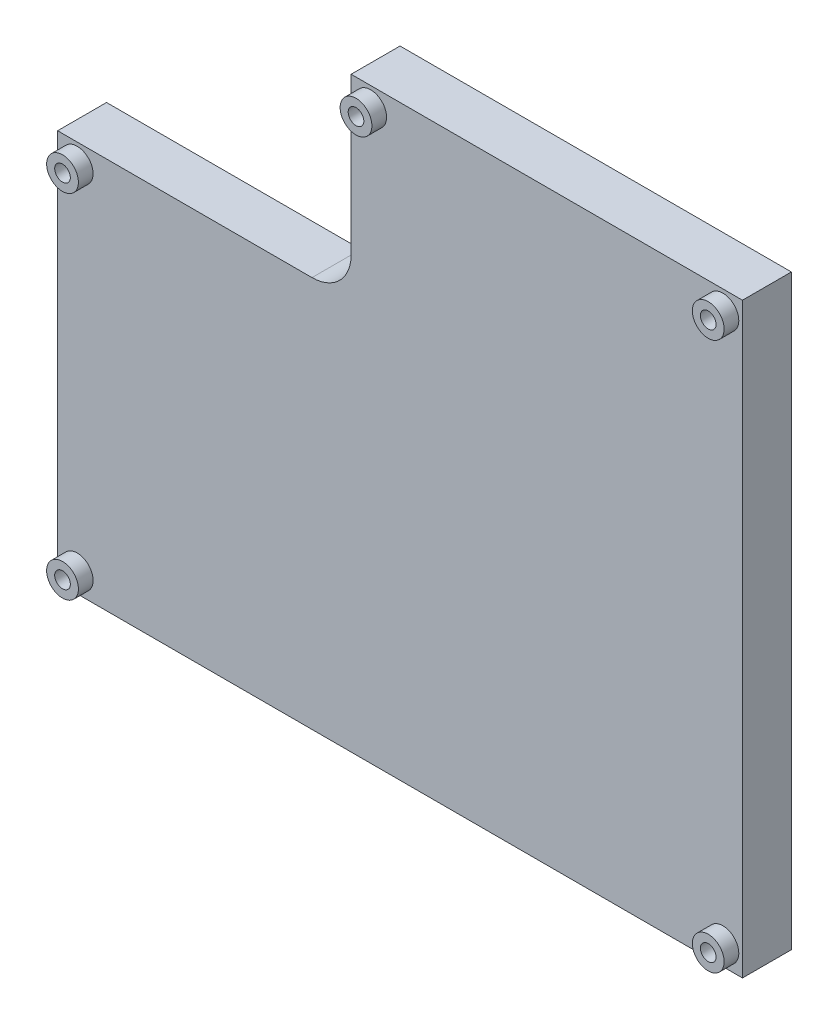
ISO-10303-21;
HEADER;
FILE_DESCRIPTION(('STEP AP214'),'2;1');
FILE_NAME('part.step','',(''),(''),'','','');
FILE_SCHEMA(('AUTOMOTIVE_DESIGN { 1 0 10303 214 1 1 1 1 }'));
ENDSEC;
DATA;
#1=APPLICATION_CONTEXT('core data for automotive mechanical design processes');
#2=APPLICATION_PROTOCOL_DEFINITION('international standard','automotive_design',2000,#1);
#3=PRODUCT_CONTEXT('',#1,'mechanical');
#4=PRODUCT('Part','Part','',(#3));
#5=PRODUCT_RELATED_PRODUCT_CATEGORY('part','',(#4));
#6=PRODUCT_DEFINITION_FORMATION('','',#4);
#7=PRODUCT_DEFINITION_CONTEXT('part definition',#1,'design');
#8=PRODUCT_DEFINITION('design','',#6,#7);
#9=PRODUCT_DEFINITION_SHAPE('','',#8);
#10=(LENGTH_UNIT() NAMED_UNIT(*) SI_UNIT(.MILLI.,.METRE.));
#11=(NAMED_UNIT(*) PLANE_ANGLE_UNIT() SI_UNIT($,.RADIAN.));
#12=(NAMED_UNIT(*) SI_UNIT($,.STERADIAN.) SOLID_ANGLE_UNIT());
#13=UNCERTAINTY_MEASURE_WITH_UNIT(LENGTH_MEASURE(1.E-05),#10,'distance_accuracy_value','');
#14=(GEOMETRIC_REPRESENTATION_CONTEXT(3) GLOBAL_UNCERTAINTY_ASSIGNED_CONTEXT((#13)) GLOBAL_UNIT_ASSIGNED_CONTEXT((#10,
#11,#12)) REPRESENTATION_CONTEXT('',''));
#15=CARTESIAN_POINT('',(0.,0.,0.));
#16=DIRECTION('',(0.,0.,1.));
#17=DIRECTION('',(1.,0.,0.));
#18=AXIS2_PLACEMENT_3D('',#15,#16,#17);
#19=CARTESIAN_POINT('',(-38.,-33.,6.5));
#20=DIRECTION('',(0.,0.,-1.));
#21=DIRECTION('',(0.,1.,0.));
#22=AXIS2_PLACEMENT_3D('',#19,#20,#21);
#23=CYLINDRICAL_SURFACE('',#22,1.62500000000001);
#24=CARTESIAN_POINT('',(-38.,-33.,5.));
#25=DIRECTION('',(0.,0.,-1.));
#26=DIRECTION('',(0.,1.,0.));
#27=AXIS2_PLACEMENT_3D('',#24,#25,#26);
#28=CIRCLE('',#27,1.62500000000001);
#29=CARTESIAN_POINT('',(-38.,-31.375,5.));
#30=VERTEX_POINT('',#29);
#31=EDGE_CURVE('E20',#30,#30,#28,.F.);
#32=ORIENTED_EDGE('',*,*,#31,.T.);
#33=EDGE_LOOP('',(#32));
#34=FACE_BOUND('',#33,.T.);
#35=CARTESIAN_POINT('',(-38.,-33.,6.5));
#36=DIRECTION('',(0.,0.,-1.));
#37=DIRECTION('',(0.,1.,0.));
#38=AXIS2_PLACEMENT_3D('',#35,#36,#37);
#39=CIRCLE('',#38,1.62500000000001);
#40=CARTESIAN_POINT('',(-38.,-31.375,6.5));
#41=VERTEX_POINT('',#40);
#42=EDGE_CURVE('E208',#41,#41,#39,.F.);
#43=ORIENTED_EDGE('',*,*,#42,.F.);
#44=EDGE_LOOP('',(#43));
#45=FACE_BOUND('',#44,.T.);
#46=ADVANCED_FACE('F16',(#34,#45),#23,.T.);
#47=CARTESIAN_POINT('',(28.,23.,6.5));
#48=DIRECTION('',(0.,0.,-1.));
#49=DIRECTION('',(0.,1.,0.));
#50=AXIS2_PLACEMENT_3D('',#47,#48,#49);
#51=CYLINDRICAL_SURFACE('',#50,1.625);
#52=CARTESIAN_POINT('',(28.,23.,5.));
#53=DIRECTION('',(0.,0.,-1.));
#54=DIRECTION('',(0.,1.,0.));
#55=AXIS2_PLACEMENT_3D('',#52,#53,#54);
#56=CIRCLE('',#55,1.625);
#57=CARTESIAN_POINT('',(28.,24.625,5.));
#58=VERTEX_POINT('',#57);
#59=EDGE_CURVE('E216',#58,#58,#56,.F.);
#60=ORIENTED_EDGE('',*,*,#59,.T.);
#61=EDGE_LOOP('',(#60));
#62=FACE_BOUND('',#61,.T.);
#63=CARTESIAN_POINT('',(28.,23.,6.5));
#64=DIRECTION('',(0.,0.,-1.));
#65=DIRECTION('',(0.,1.,0.));
#66=AXIS2_PLACEMENT_3D('',#63,#64,#65);
#67=CIRCLE('',#66,1.625);
#68=CARTESIAN_POINT('',(28.,24.625,6.5));
#69=VERTEX_POINT('',#68);
#70=EDGE_CURVE('E205',#69,#69,#67,.F.);
#71=ORIENTED_EDGE('',*,*,#70,.F.);
#72=EDGE_LOOP('',(#71));
#73=FACE_BOUND('',#72,.T.);
#74=ADVANCED_FACE('F280',(#62,#73),#51,.T.);
#75=CARTESIAN_POINT('',(-8.,23.,6.5));
#76=DIRECTION('',(0.,0.,-1.));
#77=DIRECTION('',(0.,1.,0.));
#78=AXIS2_PLACEMENT_3D('',#75,#76,#77);
#79=CYLINDRICAL_SURFACE('',#78,1.625);
#80=CARTESIAN_POINT('',(-8.,23.,5.));
#81=DIRECTION('',(0.,0.,-1.));
#82=DIRECTION('',(0.,1.,0.));
#83=AXIS2_PLACEMENT_3D('',#80,#81,#82);
#84=CIRCLE('',#83,1.625);
#85=CARTESIAN_POINT('',(-8.,24.625,5.));
#86=VERTEX_POINT('',#85);
#87=EDGE_CURVE('E214',#86,#86,#84,.F.);
#88=ORIENTED_EDGE('',*,*,#87,.T.);
#89=EDGE_LOOP('',(#88));
#90=FACE_BOUND('',#89,.T.);
#91=CARTESIAN_POINT('',(-8.,23.,6.5));
#92=DIRECTION('',(0.,0.,-1.));
#93=DIRECTION('',(0.,1.,0.));
#94=AXIS2_PLACEMENT_3D('',#91,#92,#93);
#95=CIRCLE('',#94,1.625);
#96=CARTESIAN_POINT('',(-8.,24.625,6.5));
#97=VERTEX_POINT('',#96);
#98=EDGE_CURVE('E202',#97,#97,#95,.F.);
#99=ORIENTED_EDGE('',*,*,#98,.F.);
#100=EDGE_LOOP('',(#99));
#101=FACE_BOUND('',#100,.T.);
#102=ADVANCED_FACE('F238',(#90,#101),#79,.T.);
#103=CARTESIAN_POINT('',(28.,-33.,6.5));
#104=DIRECTION('',(0.,0.,-1.));
#105=DIRECTION('',(0.,1.,0.));
#106=AXIS2_PLACEMENT_3D('',#103,#104,#105);
#107=CYLINDRICAL_SURFACE('',#106,1.625);
#108=CARTESIAN_POINT('',(28.,-33.,5.));
#109=DIRECTION('',(0.,0.,-1.));
#110=DIRECTION('',(0.,1.,0.));
#111=AXIS2_PLACEMENT_3D('',#108,#109,#110);
#112=CIRCLE('',#111,1.625);
#113=CARTESIAN_POINT('',(28.,-31.375,5.));
#114=VERTEX_POINT('',#113);
#115=EDGE_CURVE('E211',#114,#114,#112,.F.);
#116=ORIENTED_EDGE('',*,*,#115,.T.);
#117=EDGE_LOOP('',(#116));
#118=FACE_BOUND('',#117,.T.);
#119=CARTESIAN_POINT('',(28.,-33.,6.5));
#120=DIRECTION('',(0.,0.,-1.));
#121=DIRECTION('',(0.,1.,0.));
#122=AXIS2_PLACEMENT_3D('',#119,#120,#121);
#123=CIRCLE('',#122,1.625);
#124=CARTESIAN_POINT('',(28.,-31.375,6.5));
#125=VERTEX_POINT('',#124);
#126=EDGE_CURVE('E199',#125,#125,#123,.F.);
#127=ORIENTED_EDGE('',*,*,#126,.F.);
#128=EDGE_LOOP('',(#127));
#129=FACE_BOUND('',#128,.T.);
#130=ADVANCED_FACE('F227',(#118,#129),#107,.T.);
#131=CARTESIAN_POINT('',(30.,-35.,5.));
#132=DIRECTION('',(0.,0.,-1.));
#133=DIRECTION('',(-1.,0.,0.));
#134=AXIS2_PLACEMENT_3D('',#131,#132,#133);
#135=PLANE('',#134);
#136=CARTESIAN_POINT('',(-38.,3.,5.));
#137=DIRECTION('',(0.,0.,-1.));
#138=DIRECTION('',(0.,1.,0.));
#139=AXIS2_PLACEMENT_3D('',#136,#137,#138);
#140=CIRCLE('',#139,1.62500000000001);
#141=CARTESIAN_POINT('',(-38.,4.62500000000001,5.));
#142=VERTEX_POINT('',#141);
#143=EDGE_CURVE('E85',#142,#142,#140,.T.);
#144=ORIENTED_EDGE('',*,*,#143,.T.);
#145=EDGE_LOOP('',(#144));
#146=FACE_BOUND('',#145,.T.);
#147=ORIENTED_EDGE('',*,*,#115,.F.);
#148=EDGE_LOOP('',(#147));
#149=FACE_BOUND('',#148,.T.);
#150=ORIENTED_EDGE('',*,*,#87,.F.);
#151=EDGE_LOOP('',(#150));
#152=FACE_BOUND('',#151,.T.);
#153=ORIENTED_EDGE('',*,*,#59,.F.);
#154=EDGE_LOOP('',(#153));
#155=FACE_BOUND('',#154,.T.);
#156=ORIENTED_EDGE('',*,*,#31,.F.);
#157=EDGE_LOOP('',(#156));
#158=FACE_BOUND('',#157,.T.);
#159=DIRECTION('',(-1.,0.,0.));
#160=VECTOR('',#159,1.);
#161=CARTESIAN_POINT('',(-27.,5.,5.));
#162=LINE('',#161,#160);
#163=CARTESIAN_POINT('',(-14.,5.,5.));
#164=VERTEX_POINT('',#163);
#165=CARTESIAN_POINT('',(-40.,5.,5.));
#166=VERTEX_POINT('',#165);
#167=EDGE_CURVE('E78',#164,#166,#162,.T.);
#168=ORIENTED_EDGE('',*,*,#167,.T.);
#169=DIRECTION('',(0.,-1.,0.));
#170=VECTOR('',#169,1.);
#171=CARTESIAN_POINT('',(-40.,-15.,5.));
#172=LINE('',#171,#170);
#173=CARTESIAN_POINT('',(-40.,-35.,5.));
#174=VERTEX_POINT('',#173);
#175=EDGE_CURVE('E100',#166,#174,#172,.T.);
#176=ORIENTED_EDGE('',*,*,#175,.T.);
#177=DIRECTION('',(1.,0.,0.));
#178=VECTOR('',#177,1.);
#179=CARTESIAN_POINT('',(-5.,-35.,5.));
#180=LINE('',#179,#178);
#181=CARTESIAN_POINT('',(30.,-35.,5.));
#182=VERTEX_POINT('',#181);
#183=EDGE_CURVE('E124',#174,#182,#180,.T.);
#184=ORIENTED_EDGE('',*,*,#183,.T.);
#185=DIRECTION('',(0.,1.,0.));
#186=VECTOR('',#185,1.);
#187=CARTESIAN_POINT('',(30.,-5.,5.));
#188=LINE('',#187,#186);
#189=CARTESIAN_POINT('',(30.,25.,5.));
#190=VERTEX_POINT('',#189);
#191=EDGE_CURVE('E134',#182,#190,#188,.T.);
#192=ORIENTED_EDGE('',*,*,#191,.T.);
#193=DIRECTION('',(-1.,0.,0.));
#194=VECTOR('',#193,1.);
#195=CARTESIAN_POINT('',(10.,25.,5.));
#196=LINE('',#195,#194);
#197=CARTESIAN_POINT('',(-10.,25.,5.));
#198=VERTEX_POINT('',#197);
#199=EDGE_CURVE('E144',#190,#198,#196,.T.);
#200=ORIENTED_EDGE('',*,*,#199,.T.);
#201=DIRECTION('',(0.,-1.,0.));
#202=VECTOR('',#201,1.);
#203=CARTESIAN_POINT('',(-10.,17.,5.));
#204=LINE('',#203,#202);
#205=CARTESIAN_POINT('',(-10.,9.,5.));
#206=VERTEX_POINT('',#205);
#207=EDGE_CURVE('E80',#198,#206,#204,.T.);
#208=ORIENTED_EDGE('',*,*,#207,.T.);
#209=CARTESIAN_POINT('',(-14.,9.,5.));
#210=DIRECTION('',(0.,0.,-1.));
#211=DIRECTION('',(0.,1.,0.));
#212=AXIS2_PLACEMENT_3D('',#209,#210,#211);
#213=CIRCLE('',#212,4.);
#214=EDGE_CURVE('E74',#164,#206,#213,.F.);
#215=ORIENTED_EDGE('',*,*,#214,.F.);
#216=EDGE_LOOP('',(#168,#176,#184,#192,#200,#208,#215));
#217=FACE_BOUND('',#216,.T.);
#218=ADVANCED_FACE('F76',(#146,#149,#152,#155,#158,#217),#135,.F.);
#219=CARTESIAN_POINT('',(-39.6445,-34.6445,6.5));
#220=DIRECTION('',(0.,0.,1.));
#221=DIRECTION('',(1.,0.,0.));
#222=AXIS2_PLACEMENT_3D('',#219,#220,#221);
#223=PLANE('',#222);
#224=CARTESIAN_POINT('',(-38.,-33.,6.5));
#225=DIRECTION('',(0.,0.,-1.));
#226=DIRECTION('',(0.,1.,0.));
#227=AXIS2_PLACEMENT_3D('',#224,#225,#226);
#228=CIRCLE('',#227,0.800000000000002);
#229=CARTESIAN_POINT('',(-38.,-32.2,6.5));
#230=VERTEX_POINT('',#229);
#231=EDGE_CURVE('E107',#230,#230,#228,.F.);
#232=ORIENTED_EDGE('',*,*,#231,.F.);
#233=EDGE_LOOP('',(#232));
#234=FACE_BOUND('',#233,.T.);
#235=ORIENTED_EDGE('',*,*,#42,.T.);
#236=EDGE_LOOP('',(#235));
#237=FACE_BOUND('',#236,.T.);
#238=ADVANCED_FACE('F226',(#234,#237),#223,.T.);
#239=CARTESIAN_POINT('',(26.3555,21.3555,6.5));
#240=DIRECTION('',(0.,0.,1.));
#241=DIRECTION('',(1.,0.,0.));
#242=AXIS2_PLACEMENT_3D('',#239,#240,#241);
#243=PLANE('',#242);
#244=CARTESIAN_POINT('',(28.,23.,6.5));
#245=DIRECTION('',(0.,0.,-1.));
#246=DIRECTION('',(0.,1.,0.));
#247=AXIS2_PLACEMENT_3D('',#244,#245,#246);
#248=CIRCLE('',#247,0.800000000000002);
#249=CARTESIAN_POINT('',(28.,23.8,6.5));
#250=VERTEX_POINT('',#249);
#251=EDGE_CURVE('E192',#250,#250,#248,.F.);
#252=ORIENTED_EDGE('',*,*,#251,.F.);
#253=EDGE_LOOP('',(#252));
#254=FACE_BOUND('',#253,.T.);
#255=ORIENTED_EDGE('',*,*,#70,.T.);
#256=EDGE_LOOP('',(#255));
#257=FACE_BOUND('',#256,.T.);
#258=ADVANCED_FACE('F235',(#254,#257),#243,.T.);
#259=CARTESIAN_POINT('',(-9.6445,21.3555,6.5));
#260=DIRECTION('',(0.,0.,1.));
#261=DIRECTION('',(1.,0.,0.));
#262=AXIS2_PLACEMENT_3D('',#259,#260,#261);
#263=PLANE('',#262);
#264=CARTESIAN_POINT('',(-8.,23.,6.5));
#265=DIRECTION('',(0.,0.,-1.));
#266=DIRECTION('',(0.,1.,0.));
#267=AXIS2_PLACEMENT_3D('',#264,#265,#266);
#268=CIRCLE('',#267,0.8);
#269=CARTESIAN_POINT('',(-8.,23.8,6.5));
#270=VERTEX_POINT('',#269);
#271=EDGE_CURVE('E189',#270,#270,#268,.F.);
#272=ORIENTED_EDGE('',*,*,#271,.F.);
#273=EDGE_LOOP('',(#272));
#274=FACE_BOUND('',#273,.T.);
#275=ORIENTED_EDGE('',*,*,#98,.T.);
#276=EDGE_LOOP('',(#275));
#277=FACE_BOUND('',#276,.T.);
#278=ADVANCED_FACE('F322',(#274,#277),#263,.T.);
#279=CARTESIAN_POINT('',(26.3555,-34.6445,6.5));
#280=DIRECTION('',(0.,0.,1.));
#281=DIRECTION('',(1.,0.,0.));
#282=AXIS2_PLACEMENT_3D('',#279,#280,#281);
#283=PLANE('',#282);
#284=CARTESIAN_POINT('',(28.,-33.,6.5));
#285=DIRECTION('',(0.,0.,-1.));
#286=DIRECTION('',(0.,1.,0.));
#287=AXIS2_PLACEMENT_3D('',#284,#285,#286);
#288=CIRCLE('',#287,0.800000000000002);
#289=CARTESIAN_POINT('',(28.,-32.2,6.5));
#290=VERTEX_POINT('',#289);
#291=EDGE_CURVE('E186',#290,#290,#288,.F.);
#292=ORIENTED_EDGE('',*,*,#291,.F.);
#293=EDGE_LOOP('',(#292));
#294=FACE_BOUND('',#293,.T.);
#295=ORIENTED_EDGE('',*,*,#126,.T.);
#296=EDGE_LOOP('',(#295));
#297=FACE_BOUND('',#296,.T.);
#298=ADVANCED_FACE('F275',(#294,#297),#283,.T.);
#299=CARTESIAN_POINT('',(-38.,3.,6.5));
#300=DIRECTION('',(0.,0.,-1.));
#301=DIRECTION('',(0.,1.,0.));
#302=AXIS2_PLACEMENT_3D('',#299,#300,#301);
#303=CYLINDRICAL_SURFACE('',#302,1.62500000000001);
#304=ORIENTED_EDGE('',*,*,#143,.F.);
#305=EDGE_LOOP('',(#304));
#306=FACE_BOUND('',#305,.T.);
#307=CARTESIAN_POINT('',(-38.,3.,6.5));
#308=DIRECTION('',(0.,0.,-1.));
#309=DIRECTION('',(0.,1.,0.));
#310=AXIS2_PLACEMENT_3D('',#307,#308,#309);
#311=CIRCLE('',#310,1.62500000000001);
#312=CARTESIAN_POINT('',(-38.,4.62500000000001,6.5));
#313=VERTEX_POINT('',#312);
#314=EDGE_CURVE('E183',#313,#313,#311,.F.);
#315=ORIENTED_EDGE('',*,*,#314,.F.);
#316=EDGE_LOOP('',(#315));
#317=FACE_BOUND('',#316,.T.);
#318=ADVANCED_FACE('F273',(#306,#317),#303,.T.);
#319=CARTESIAN_POINT('',(-14.,9.,5.));
#320=DIRECTION('',(0.,0.,-1.));
#321=DIRECTION('',(0.,1.,0.));
#322=AXIS2_PLACEMENT_3D('',#319,#320,#321);
#323=CYLINDRICAL_SURFACE('',#322,4.);
#324=ORIENTED_EDGE('',*,*,#214,.T.);
#325=DIRECTION('',(0.,0.,-1.));
#326=VECTOR('',#325,1.);
#327=CARTESIAN_POINT('',(-10.,9.,2.5));
#328=LINE('',#327,#326);
#329=CARTESIAN_POINT('',(-9.999999985,9.,0.));
#330=VERTEX_POINT('',#329);
#331=EDGE_CURVE('E147',#206,#330,#328,.T.);
#332=ORIENTED_EDGE('',*,*,#331,.T.);
#333=CARTESIAN_POINT('',(-14.,9.,0.));
#334=DIRECTION('',(0.,0.,-1.));
#335=DIRECTION('',(0.,1.,0.));
#336=AXIS2_PLACEMENT_3D('',#333,#334,#335);
#337=CIRCLE('',#336,4.);
#338=CARTESIAN_POINT('',(-14.,5.00000001,0.));
#339=VERTEX_POINT('',#338);
#340=EDGE_CURVE('E96',#339,#330,#337,.F.);
#341=ORIENTED_EDGE('',*,*,#340,.F.);
#342=DIRECTION('',(0.,0.,1.));
#343=VECTOR('',#342,1.);
#344=CARTESIAN_POINT('',(-14.,5.,2.5));
#345=LINE('',#344,#343);
#346=EDGE_CURVE('E91',#339,#164,#345,.T.);
#347=ORIENTED_EDGE('',*,*,#346,.T.);
#348=EDGE_LOOP('',(#324,#332,#341,#347));
#349=FACE_BOUND('',#348,.T.);
#350=ADVANCED_FACE('F95',(#349),#323,.F.);
#351=CARTESIAN_POINT('',(-10.,9.,0.));
#352=DIRECTION('',(1.,0.,0.));
#353=DIRECTION('',(0.,1.,0.));
#354=AXIS2_PLACEMENT_3D('',#351,#352,#353);
#355=PLANE('',#354);
#356=ORIENTED_EDGE('',*,*,#331,.F.);
#357=ORIENTED_EDGE('',*,*,#207,.F.);
#358=DIRECTION('',(0.,0.,-1.));
#359=VECTOR('',#358,1.);
#360=CARTESIAN_POINT('',(-10.,25.,2.5));
#361=LINE('',#360,#359);
#362=CARTESIAN_POINT('',(-9.99999998,25.,0.));
#363=VERTEX_POINT('',#362);
#364=EDGE_CURVE('E141',#198,#363,#361,.T.);
#365=ORIENTED_EDGE('',*,*,#364,.T.);
#366=DIRECTION('',(0.,1.,0.));
#367=VECTOR('',#366,1.);
#368=CARTESIAN_POINT('',(-9.99999997,-5.,0.));
#369=LINE('',#368,#367);
#370=EDGE_CURVE('E138',#330,#363,#369,.T.);
#371=ORIENTED_EDGE('',*,*,#370,.F.);
#372=EDGE_LOOP('',(#356,#357,#365,#371));
#373=FACE_BOUND('',#372,.T.);
#374=ADVANCED_FACE('F272',(#373),#355,.F.);
#375=CARTESIAN_POINT('',(-10.,25.,5.));
#376=DIRECTION('',(0.,-1.,0.));
#377=DIRECTION('',(0.,0.,-1.));
#378=AXIS2_PLACEMENT_3D('',#375,#376,#377);
#379=PLANE('',#378);
#380=ORIENTED_EDGE('',*,*,#364,.F.);
#381=ORIENTED_EDGE('',*,*,#199,.F.);
#382=DIRECTION('',(0.,0.,-1.));
#383=VECTOR('',#382,1.);
#384=CARTESIAN_POINT('',(30.,25.,2.5));
#385=LINE('',#384,#383);
#386=CARTESIAN_POINT('',(30.,25.,0.));
#387=VERTEX_POINT('',#386);
#388=EDGE_CURVE('E131',#190,#387,#385,.T.);
#389=ORIENTED_EDGE('',*,*,#388,.T.);
#390=DIRECTION('',(1.,0.,0.));
#391=VECTOR('',#390,1.);
#392=CARTESIAN_POINT('',(-5.,25.,0.));
#393=LINE('',#392,#391);
#394=EDGE_CURVE('E128',#363,#387,#393,.T.);
#395=ORIENTED_EDGE('',*,*,#394,.F.);
#396=EDGE_LOOP('',(#380,#381,#389,#395));
#397=FACE_BOUND('',#396,.T.);
#398=ADVANCED_FACE('F362',(#397),#379,.F.);
#399=CARTESIAN_POINT('',(30.,25.,0.));
#400=DIRECTION('',(-1.,0.,0.));
#401=DIRECTION('',(0.,-1.,0.));
#402=AXIS2_PLACEMENT_3D('',#399,#400,#401);
#403=PLANE('',#402);
#404=ORIENTED_EDGE('',*,*,#388,.F.);
#405=ORIENTED_EDGE('',*,*,#191,.F.);
#406=DIRECTION('',(0.,0.,-1.));
#407=VECTOR('',#406,1.);
#408=CARTESIAN_POINT('',(30.,-35.,2.5));
#409=LINE('',#408,#407);
#410=CARTESIAN_POINT('',(30.,-35.,0.));
#411=VERTEX_POINT('',#410);
#412=EDGE_CURVE('E121',#182,#411,#409,.T.);
#413=ORIENTED_EDGE('',*,*,#412,.T.);
#414=DIRECTION('',(0.,-1.,0.));
#415=VECTOR('',#414,1.);
#416=CARTESIAN_POINT('',(30.,-5.,0.));
#417=LINE('',#416,#415);
#418=EDGE_CURVE('E118',#387,#411,#417,.T.);
#419=ORIENTED_EDGE('',*,*,#418,.F.);
#420=EDGE_LOOP('',(#404,#405,#413,#419));
#421=FACE_BOUND('',#420,.T.);
#422=ADVANCED_FACE('F372',(#421),#403,.F.);
#423=CARTESIAN_POINT('',(-40.,-35.,0.));
#424=DIRECTION('',(0.,1.,0.));
#425=DIRECTION('',(0.,0.,1.));
#426=AXIS2_PLACEMENT_3D('',#423,#424,#425);
#427=PLANE('',#426);
#428=ORIENTED_EDGE('',*,*,#412,.F.);
#429=ORIENTED_EDGE('',*,*,#183,.F.);
#430=DIRECTION('',(0.,0.,-1.));
#431=VECTOR('',#430,1.);
#432=CARTESIAN_POINT('',(-40.,-35.,2.5));
#433=LINE('',#432,#431);
#434=CARTESIAN_POINT('',(-40.,-35.,0.));
#435=VERTEX_POINT('',#434);
#436=EDGE_CURVE('E97',#174,#435,#433,.T.);
#437=ORIENTED_EDGE('',*,*,#436,.T.);
#438=DIRECTION('',(-1.,0.,0.));
#439=VECTOR('',#438,1.);
#440=CARTESIAN_POINT('',(-5.,-35.,0.));
#441=LINE('',#440,#439);
#442=EDGE_CURVE('E112',#411,#435,#441,.T.);
#443=ORIENTED_EDGE('',*,*,#442,.F.);
#444=EDGE_LOOP('',(#428,#429,#437,#443));
#445=FACE_BOUND('',#444,.T.);
#446=ADVANCED_FACE('F382',(#445),#427,.F.);
#447=CARTESIAN_POINT('',(-40.,-35.,0.));
#448=DIRECTION('',(1.,0.,0.));
#449=DIRECTION('',(0.,1.,0.));
#450=AXIS2_PLACEMENT_3D('',#447,#448,#449);
#451=PLANE('',#450);
#452=ORIENTED_EDGE('',*,*,#436,.F.);
#453=ORIENTED_EDGE('',*,*,#175,.F.);
#454=DIRECTION('',(0.,0.,-1.));
#455=VECTOR('',#454,1.);
#456=CARTESIAN_POINT('',(-40.,5.,2.5));
#457=LINE('',#456,#455);
#458=CARTESIAN_POINT('',(-40.,5.00000001333334,0.));
#459=VERTEX_POINT('',#458);
#460=EDGE_CURVE('E92',#166,#459,#457,.T.);
#461=ORIENTED_EDGE('',*,*,#460,.T.);
#462=DIRECTION('',(0.,1.,0.));
#463=VECTOR('',#462,1.);
#464=CARTESIAN_POINT('',(-40.,-5.,0.));
#465=LINE('',#464,#463);
#466=EDGE_CURVE('E35',#435,#459,#465,.T.);
#467=ORIENTED_EDGE('',*,*,#466,.F.);
#468=EDGE_LOOP('',(#452,#453,#461,#467));
#469=FACE_BOUND('',#468,.T.);
#470=ADVANCED_FACE('F392',(#469),#451,.F.);
#471=CARTESIAN_POINT('',(-40.,5.,0.));
#472=DIRECTION('',(0.,-1.,0.));
#473=DIRECTION('',(1.,0.,0.));
#474=AXIS2_PLACEMENT_3D('',#471,#472,#473);
#475=PLANE('',#474);
#476=ORIENTED_EDGE('',*,*,#460,.F.);
#477=ORIENTED_EDGE('',*,*,#167,.F.);
#478=ORIENTED_EDGE('',*,*,#346,.F.);
#479=DIRECTION('',(1.,0.,0.));
#480=VECTOR('',#479,1.);
#481=CARTESIAN_POINT('',(-5.,5.00000002000001,0.));
#482=LINE('',#481,#480);
#483=EDGE_CURVE('E111',#459,#339,#482,.T.);
#484=ORIENTED_EDGE('',*,*,#483,.F.);
#485=EDGE_LOOP('',(#476,#477,#478,#484));
#486=FACE_BOUND('',#485,.T.);
#487=ADVANCED_FACE('F89',(#486),#475,.F.);
#488=CARTESIAN_POINT('',(-38.,-33.,6.5));
#489=DIRECTION('',(0.,0.,-1.));
#490=DIRECTION('',(0.,1.,0.));
#491=AXIS2_PLACEMENT_3D('',#488,#489,#490);
#492=CYLINDRICAL_SURFACE('',#491,0.800000000000002);
#493=ORIENTED_EDGE('',*,*,#231,.T.);
#494=EDGE_LOOP('',(#493));
#495=FACE_BOUND('',#494,.T.);
#496=CARTESIAN_POINT('',(-38.,-33.,0.));
#497=DIRECTION('',(0.,0.,-1.));
#498=DIRECTION('',(0.,1.,0.));
#499=AXIS2_PLACEMENT_3D('',#496,#497,#498);
#500=CIRCLE('',#499,0.800000000000002);
#501=CARTESIAN_POINT('',(-38.,-32.2,0.));
#502=VERTEX_POINT('',#501);
#503=EDGE_CURVE('E179',#502,#502,#500,.F.);
#504=ORIENTED_EDGE('',*,*,#503,.F.);
#505=EDGE_LOOP('',(#504));
#506=FACE_BOUND('',#505,.T.);
#507=ADVANCED_FACE('F265',(#495,#506),#492,.F.);
#508=CARTESIAN_POINT('',(28.,23.,6.5));
#509=DIRECTION('',(0.,0.,-1.));
#510=DIRECTION('',(0.,1.,0.));
#511=AXIS2_PLACEMENT_3D('',#508,#509,#510);
#512=CYLINDRICAL_SURFACE('',#511,0.800000000000002);
#513=ORIENTED_EDGE('',*,*,#251,.T.);
#514=EDGE_LOOP('',(#513));
#515=FACE_BOUND('',#514,.T.);
#516=CARTESIAN_POINT('',(28.,23.,0.));
#517=DIRECTION('',(0.,0.,-1.));
#518=DIRECTION('',(0.,1.,0.));
#519=AXIS2_PLACEMENT_3D('',#516,#517,#518);
#520=CIRCLE('',#519,0.800000000000002);
#521=CARTESIAN_POINT('',(28.,23.8,0.));
#522=VERTEX_POINT('',#521);
#523=EDGE_CURVE('E176',#522,#522,#520,.F.);
#524=ORIENTED_EDGE('',*,*,#523,.F.);
#525=EDGE_LOOP('',(#524));
#526=FACE_BOUND('',#525,.T.);
#527=ADVANCED_FACE('F261',(#515,#526),#512,.F.);
#528=CARTESIAN_POINT('',(-8.,23.,6.5));
#529=DIRECTION('',(0.,0.,-1.));
#530=DIRECTION('',(0.,1.,0.));
#531=AXIS2_PLACEMENT_3D('',#528,#529,#530);
#532=CYLINDRICAL_SURFACE('',#531,0.8);
#533=ORIENTED_EDGE('',*,*,#271,.T.);
#534=EDGE_LOOP('',(#533));
#535=FACE_BOUND('',#534,.T.);
#536=CARTESIAN_POINT('',(-8.,23.,0.));
#537=DIRECTION('',(0.,0.,-1.));
#538=DIRECTION('',(0.,1.,0.));
#539=AXIS2_PLACEMENT_3D('',#536,#537,#538);
#540=CIRCLE('',#539,0.8);
#541=CARTESIAN_POINT('',(-8.,23.8,0.));
#542=VERTEX_POINT('',#541);
#543=EDGE_CURVE('E173',#542,#542,#540,.F.);
#544=ORIENTED_EDGE('',*,*,#543,.F.);
#545=EDGE_LOOP('',(#544));
#546=FACE_BOUND('',#545,.T.);
#547=ADVANCED_FACE('F257',(#535,#546),#532,.F.);
#548=CARTESIAN_POINT('',(28.,-33.,6.5));
#549=DIRECTION('',(0.,0.,-1.));
#550=DIRECTION('',(0.,1.,0.));
#551=AXIS2_PLACEMENT_3D('',#548,#549,#550);
#552=CYLINDRICAL_SURFACE('',#551,0.800000000000002);
#553=ORIENTED_EDGE('',*,*,#291,.T.);
#554=EDGE_LOOP('',(#553));
#555=FACE_BOUND('',#554,.T.);
#556=CARTESIAN_POINT('',(28.,-33.,0.));
#557=DIRECTION('',(0.,0.,-1.));
#558=DIRECTION('',(0.,1.,0.));
#559=AXIS2_PLACEMENT_3D('',#556,#557,#558);
#560=CIRCLE('',#559,0.800000000000002);
#561=CARTESIAN_POINT('',(28.,-32.2,0.));
#562=VERTEX_POINT('',#561);
#563=EDGE_CURVE('E170',#562,#562,#560,.F.);
#564=ORIENTED_EDGE('',*,*,#563,.F.);
#565=EDGE_LOOP('',(#564));
#566=FACE_BOUND('',#565,.T.);
#567=ADVANCED_FACE('F254',(#555,#566),#552,.F.);
#568=CARTESIAN_POINT('',(-39.6445,1.3555,6.5));
#569=DIRECTION('',(0.,0.,1.));
#570=DIRECTION('',(1.,0.,0.));
#571=AXIS2_PLACEMENT_3D('',#568,#569,#570);
#572=PLANE('',#571);
#573=CARTESIAN_POINT('',(-38.,3.,6.5));
#574=DIRECTION('',(0.,0.,-1.));
#575=DIRECTION('',(0.,1.,0.));
#576=AXIS2_PLACEMENT_3D('',#573,#574,#575);
#577=CIRCLE('',#576,0.800000000000002);
#578=CARTESIAN_POINT('',(-38.,3.8,6.5));
#579=VERTEX_POINT('',#578);
#580=EDGE_CURVE('E26',#579,#579,#577,.F.);
#581=ORIENTED_EDGE('',*,*,#580,.F.);
#582=EDGE_LOOP('',(#581));
#583=FACE_BOUND('',#582,.T.);
#584=ORIENTED_EDGE('',*,*,#314,.T.);
#585=EDGE_LOOP('',(#584));
#586=FACE_BOUND('',#585,.T.);
#587=ADVANCED_FACE('F250',(#583,#586),#572,.T.);
#588=CARTESIAN_POINT('',(30.,-35.,0.));
#589=DIRECTION('',(0.,0.,-1.));
#590=DIRECTION('',(-1.,0.,0.));
#591=AXIS2_PLACEMENT_3D('',#588,#589,#590);
#592=PLANE('',#591);
#593=CARTESIAN_POINT('',(-38.,3.,0.));
#594=DIRECTION('',(0.,0.,-1.));
#595=DIRECTION('',(0.,1.,0.));
#596=AXIS2_PLACEMENT_3D('',#593,#594,#595);
#597=CIRCLE('',#596,0.800000000000002);
#598=CARTESIAN_POINT('',(-38.,3.8,0.));
#599=VERTEX_POINT('',#598);
#600=EDGE_CURVE('E11',#599,#599,#597,.T.);
#601=ORIENTED_EDGE('',*,*,#600,.F.);
#602=EDGE_LOOP('',(#601));
#603=FACE_BOUND('',#602,.T.);
#604=ORIENTED_EDGE('',*,*,#563,.T.);
#605=EDGE_LOOP('',(#604));
#606=FACE_BOUND('',#605,.T.);
#607=ORIENTED_EDGE('',*,*,#543,.T.);
#608=EDGE_LOOP('',(#607));
#609=FACE_BOUND('',#608,.T.);
#610=ORIENTED_EDGE('',*,*,#523,.T.);
#611=EDGE_LOOP('',(#610));
#612=FACE_BOUND('',#611,.T.);
#613=ORIENTED_EDGE('',*,*,#503,.T.);
#614=EDGE_LOOP('',(#613));
#615=FACE_BOUND('',#614,.T.);
#616=ORIENTED_EDGE('',*,*,#466,.T.);
#617=ORIENTED_EDGE('',*,*,#483,.T.);
#618=ORIENTED_EDGE('',*,*,#340,.T.);
#619=ORIENTED_EDGE('',*,*,#370,.T.);
#620=ORIENTED_EDGE('',*,*,#394,.T.);
#621=ORIENTED_EDGE('',*,*,#418,.T.);
#622=ORIENTED_EDGE('',*,*,#442,.T.);
#623=EDGE_LOOP('',(#616,#617,#618,#619,#620,#621,#622));
#624=FACE_BOUND('',#623,.T.);
#625=ADVANCED_FACE('F18',(#603,#606,#609,#612,#615,#624),#592,.T.);
#626=CARTESIAN_POINT('',(-38.,3.,6.5));
#627=DIRECTION('',(0.,0.,-1.));
#628=DIRECTION('',(0.,1.,0.));
#629=AXIS2_PLACEMENT_3D('',#626,#627,#628);
#630=CYLINDRICAL_SURFACE('',#629,0.800000000000002);
#631=ORIENTED_EDGE('',*,*,#600,.T.);
#632=EDGE_LOOP('',(#631));
#633=FACE_BOUND('',#632,.T.);
#634=ORIENTED_EDGE('',*,*,#580,.T.);
#635=EDGE_LOOP('',(#634));
#636=FACE_BOUND('',#635,.T.);
#637=ADVANCED_FACE('F243',(#633,#636),#630,.F.);
#638=CLOSED_SHELL('',(#46,#74,#102,#130,#218,#238,#258,#278,#298,#318,#350,#374,#398,#422,#446,
#470,#487,#507,#527,#547,#567,#587,#625,#637));
#639=MANIFOLD_SOLID_BREP('B1',#638);
#640=ADVANCED_BREP_SHAPE_REPRESENTATION('',(#18,#639),#14);
#641=SHAPE_DEFINITION_REPRESENTATION(#9,#640);
ENDSEC;
END-ISO-10303-21;
